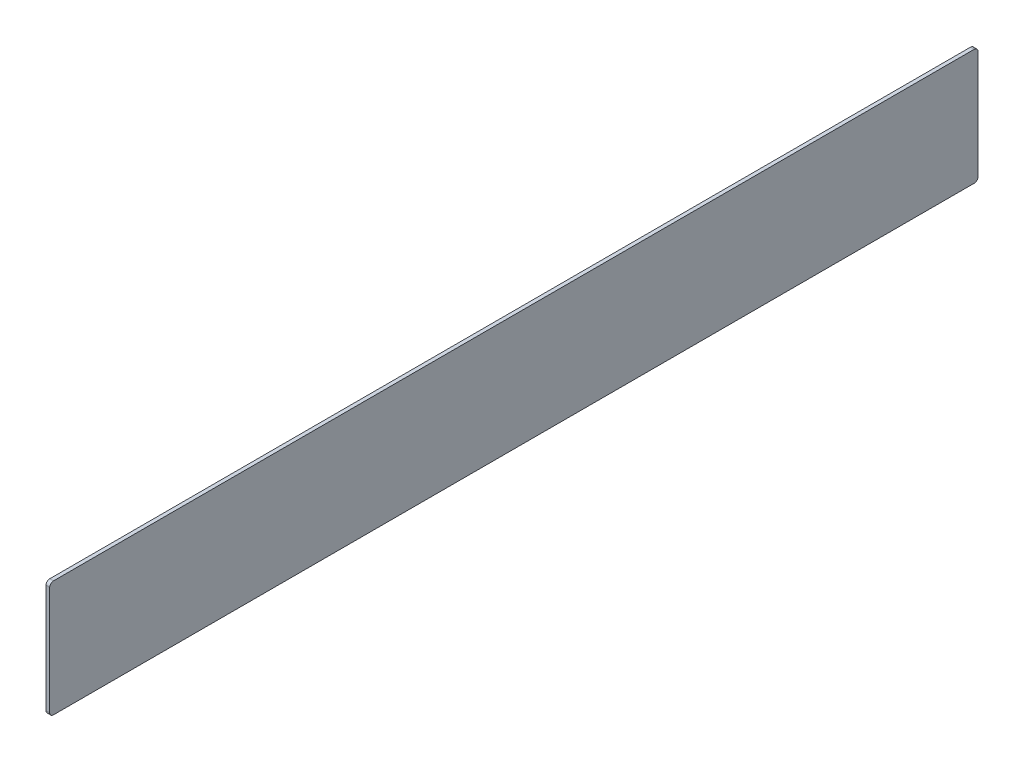
ISO-10303-21;
HEADER;
FILE_DESCRIPTION(('STEP AP214'),'2;1');
FILE_NAME('part.step','',(''),(''),'','','');
FILE_SCHEMA(('AUTOMOTIVE_DESIGN { 1 0 10303 214 1 1 1 1 }'));
ENDSEC;
DATA;
#1=APPLICATION_CONTEXT('core data for automotive mechanical design processes');
#2=APPLICATION_PROTOCOL_DEFINITION('international standard','automotive_design',2000,#1);
#3=PRODUCT_CONTEXT('',#1,'mechanical');
#4=PRODUCT('Part','Part','',(#3));
#5=PRODUCT_RELATED_PRODUCT_CATEGORY('part','',(#4));
#6=PRODUCT_DEFINITION_FORMATION('','',#4);
#7=PRODUCT_DEFINITION_CONTEXT('part definition',#1,'design');
#8=PRODUCT_DEFINITION('design','',#6,#7);
#9=PRODUCT_DEFINITION_SHAPE('','',#8);
#10=(LENGTH_UNIT() NAMED_UNIT(*) SI_UNIT(.MILLI.,.METRE.));
#11=(NAMED_UNIT(*) PLANE_ANGLE_UNIT() SI_UNIT($,.RADIAN.));
#12=(NAMED_UNIT(*) SI_UNIT($,.STERADIAN.) SOLID_ANGLE_UNIT());
#13=UNCERTAINTY_MEASURE_WITH_UNIT(LENGTH_MEASURE(1.E-05),#10,'distance_accuracy_value','');
#14=(GEOMETRIC_REPRESENTATION_CONTEXT(3) GLOBAL_UNCERTAINTY_ASSIGNED_CONTEXT((#13)) GLOBAL_UNIT_ASSIGNED_CONTEXT((#10,
#11,#12)) REPRESENTATION_CONTEXT('',''));
#15=CARTESIAN_POINT('',(0.,0.,0.));
#16=DIRECTION('',(0.,0.,1.));
#17=DIRECTION('',(1.,0.,0.));
#18=AXIS2_PLACEMENT_3D('',#15,#16,#17);
#19=CARTESIAN_POINT('',(2.,-77.7925531914894,269.946808510638));
#20=DIRECTION('',(0.,0.,-1.));
#21=DIRECTION('',(-1.,0.,0.));
#22=AXIS2_PLACEMENT_3D('',#19,#20,#21);
#23=PLANE('',#22);
#24=DIRECTION('',(0.,-1.,0.));
#25=VECTOR('',#24,1.);
#26=CARTESIAN_POINT('',(0.,-77.7925531914894,269.946808510638));
#27=LINE('',#26,#25);
#28=CARTESIAN_POINT('',(0.,-79.7925531914894,269.946808510638));
#29=VERTEX_POINT('',#28);
#30=CARTESIAN_POINT('',(0.,-138.292553191489,269.946808510638));
#31=VERTEX_POINT('',#30);
#32=EDGE_CURVE('E129',#29,#31,#27,.T.);
#33=ORIENTED_EDGE('',*,*,#32,.T.);
#34=DIRECTION('',(-1.,0.,0.));
#35=VECTOR('',#34,1.);
#36=CARTESIAN_POINT('',(2.,-138.292553191489,269.946808510638));
#37=LINE('',#36,#35);
#38=CARTESIAN_POINT('',(2.,-138.292553191489,269.946808510638));
#39=VERTEX_POINT('',#38);
#40=EDGE_CURVE('E11',#31,#39,#37,.F.);
#41=ORIENTED_EDGE('',*,*,#40,.T.);
#42=DIRECTION('',(0.,-1.,0.));
#43=VECTOR('',#42,1.);
#44=CARTESIAN_POINT('',(2.,-77.7925531914894,269.946808510638));
#45=LINE('',#44,#43);
#46=CARTESIAN_POINT('',(2.,-79.7925531914894,269.946808510638));
#47=VERTEX_POINT('',#46);
#48=EDGE_CURVE('E127',#47,#39,#45,.T.);
#49=ORIENTED_EDGE('',*,*,#48,.F.);
#50=DIRECTION('',(-1.,0.,0.));
#51=VECTOR('',#50,1.);
#52=CARTESIAN_POINT('',(2.,-79.7925531914894,269.946808510638));
#53=LINE('',#52,#51);
#54=EDGE_CURVE('E41',#47,#29,#53,.T.);
#55=ORIENTED_EDGE('',*,*,#54,.T.);
#56=EDGE_LOOP('',(#33,#41,#49,#55));
#57=FACE_BOUND('',#56,.T.);
#58=ADVANCED_FACE('F33',(#57),#23,.F.);
#59=CARTESIAN_POINT('',(2.,-140.292553191489,269.946808510638));
#60=DIRECTION('',(0.,1.,0.));
#61=DIRECTION('',(0.,0.,1.));
#62=AXIS2_PLACEMENT_3D('',#59,#60,#61);
#63=PLANE('',#62);
#64=DIRECTION('',(0.,0.,-1.));
#65=VECTOR('',#64,1.);
#66=CARTESIAN_POINT('',(0.,-140.292553191489,269.946808510638));
#67=LINE('',#66,#65);
#68=CARTESIAN_POINT('',(0.,-140.292553191489,267.946808510638));
#69=VERTEX_POINT('',#68);
#70=CARTESIAN_POINT('',(0.,-140.292553191489,-228.053191489362));
#71=VERTEX_POINT('',#70);
#72=EDGE_CURVE('E125',#69,#71,#67,.T.);
#73=ORIENTED_EDGE('',*,*,#72,.T.);
#74=DIRECTION('',(-1.,0.,0.));
#75=VECTOR('',#74,1.);
#76=CARTESIAN_POINT('',(2.,-140.292553191489,-228.053191489362));
#77=LINE('',#76,#75);
#78=CARTESIAN_POINT('',(2.,-140.292553191489,-228.053191489362));
#79=VERTEX_POINT('',#78);
#80=EDGE_CURVE('E104',#71,#79,#77,.F.);
#81=ORIENTED_EDGE('',*,*,#80,.T.);
#82=DIRECTION('',(0.,0.,-1.));
#83=VECTOR('',#82,1.);
#84=CARTESIAN_POINT('',(2.,-140.292553191489,269.946808510638));
#85=LINE('',#84,#83);
#86=CARTESIAN_POINT('',(2.,-140.292553191489,267.946808510638));
#87=VERTEX_POINT('',#86);
#88=EDGE_CURVE('E165',#87,#79,#85,.T.);
#89=ORIENTED_EDGE('',*,*,#88,.F.);
#90=DIRECTION('',(-1.,0.,0.));
#91=VECTOR('',#90,1.);
#92=CARTESIAN_POINT('',(2.,-140.292553191489,267.946808510638));
#93=LINE('',#92,#91);
#94=EDGE_CURVE('E109',#87,#69,#93,.T.);
#95=ORIENTED_EDGE('',*,*,#94,.T.);
#96=EDGE_LOOP('',(#73,#81,#89,#95));
#97=FACE_BOUND('',#96,.T.);
#98=ADVANCED_FACE('F175',(#97),#63,.F.);
#99=CARTESIAN_POINT('',(2.,-77.7925531914894,-230.053191489362));
#100=DIRECTION('',(0.,0.,1.));
#101=DIRECTION('',(0.,-1.,0.));
#102=AXIS2_PLACEMENT_3D('',#99,#100,#101);
#103=PLANE('',#102);
#104=DIRECTION('',(0.,1.,0.));
#105=VECTOR('',#104,1.);
#106=CARTESIAN_POINT('',(2.,-77.7925531914894,-230.053191489362));
#107=LINE('',#106,#105);
#108=CARTESIAN_POINT('',(2.,-138.292553191489,-230.053191489362));
#109=VERTEX_POINT('',#108);
#110=CARTESIAN_POINT('',(2.,-79.7925531914894,-230.053191489362));
#111=VERTEX_POINT('',#110);
#112=EDGE_CURVE('E118',#109,#111,#107,.T.);
#113=ORIENTED_EDGE('',*,*,#112,.F.);
#114=DIRECTION('',(-1.,0.,0.));
#115=VECTOR('',#114,1.);
#116=CARTESIAN_POINT('',(2.,-138.292553191489,-230.053191489362));
#117=LINE('',#116,#115);
#118=CARTESIAN_POINT('',(0.,-138.292553191489,-230.053191489362));
#119=VERTEX_POINT('',#118);
#120=EDGE_CURVE('E103',#109,#119,#117,.T.);
#121=ORIENTED_EDGE('',*,*,#120,.T.);
#122=DIRECTION('',(0.,1.,0.));
#123=VECTOR('',#122,1.);
#124=CARTESIAN_POINT('',(0.,-77.7925531914894,-230.053191489362));
#125=LINE('',#124,#123);
#126=CARTESIAN_POINT('',(0.,-79.7925531914894,-230.053191489362));
#127=VERTEX_POINT('',#126);
#128=EDGE_CURVE('E116',#119,#127,#125,.T.);
#129=ORIENTED_EDGE('',*,*,#128,.T.);
#130=DIRECTION('',(-1.,0.,0.));
#131=VECTOR('',#130,1.);
#132=CARTESIAN_POINT('',(2.,-79.7925531914894,-230.053191489362));
#133=LINE('',#132,#131);
#134=EDGE_CURVE('E120',#127,#111,#133,.F.);
#135=ORIENTED_EDGE('',*,*,#134,.T.);
#136=EDGE_LOOP('',(#113,#121,#129,#135));
#137=FACE_BOUND('',#136,.T.);
#138=ADVANCED_FACE('F115',(#137),#103,.F.);
#139=CARTESIAN_POINT('',(2.,-77.7925531914894,269.946808510638));
#140=DIRECTION('',(0.,-1.,0.));
#141=DIRECTION('',(0.,0.,-1.));
#142=AXIS2_PLACEMENT_3D('',#139,#140,#141);
#143=PLANE('',#142);
#144=DIRECTION('',(0.,0.,1.));
#145=VECTOR('',#144,1.);
#146=CARTESIAN_POINT('',(2.,-77.7925531914894,269.946808510638));
#147=LINE('',#146,#145);
#148=CARTESIAN_POINT('',(2.,-77.7925531914894,-228.053191489362));
#149=VERTEX_POINT('',#148);
#150=CARTESIAN_POINT('',(2.,-77.7925531914894,267.946808510638));
#151=VERTEX_POINT('',#150);
#152=EDGE_CURVE('E133',#149,#151,#147,.T.);
#153=ORIENTED_EDGE('',*,*,#152,.F.);
#154=DIRECTION('',(-1.,0.,0.));
#155=VECTOR('',#154,1.);
#156=CARTESIAN_POINT('',(2.,-77.7925531914894,-228.053191489362));
#157=LINE('',#156,#155);
#158=CARTESIAN_POINT('',(0.,-77.7925531914894,-228.053191489362));
#159=VERTEX_POINT('',#158);
#160=EDGE_CURVE('E150',#149,#159,#157,.T.);
#161=ORIENTED_EDGE('',*,*,#160,.T.);
#162=DIRECTION('',(0.,0.,1.));
#163=VECTOR('',#162,1.);
#164=CARTESIAN_POINT('',(0.,-77.7925531914894,269.946808510638));
#165=LINE('',#164,#163);
#166=CARTESIAN_POINT('',(0.,-77.7925531914894,267.946808510638));
#167=VERTEX_POINT('',#166);
#168=EDGE_CURVE('E124',#159,#167,#165,.T.);
#169=ORIENTED_EDGE('',*,*,#168,.T.);
#170=DIRECTION('',(-1.,0.,0.));
#171=VECTOR('',#170,1.);
#172=CARTESIAN_POINT('',(2.,-77.7925531914894,267.946808510638));
#173=LINE('',#172,#171);
#174=EDGE_CURVE('E48',#167,#151,#173,.F.);
#175=ORIENTED_EDGE('',*,*,#174,.T.);
#176=EDGE_LOOP('',(#153,#161,#169,#175));
#177=FACE_BOUND('',#176,.T.);
#178=ADVANCED_FACE('F179',(#177),#143,.F.);
#179=CARTESIAN_POINT('',(2.,0.,0.));
#180=DIRECTION('',(1.,0.,0.));
#181=DIRECTION('',(0.,0.,-1.));
#182=AXIS2_PLACEMENT_3D('',#179,#180,#181);
#183=PLANE('',#182);
#184=ORIENTED_EDGE('',*,*,#88,.T.);
#185=CARTESIAN_POINT('',(2.,-138.292553191489,-228.053191489362));
#186=DIRECTION('',(1.,0.,0.));
#187=DIRECTION('',(0.,0.,-1.));
#188=AXIS2_PLACEMENT_3D('',#185,#186,#187);
#189=CIRCLE('',#188,2.);
#190=EDGE_CURVE('E147',#79,#109,#189,.T.);
#191=ORIENTED_EDGE('',*,*,#190,.T.);
#192=ORIENTED_EDGE('',*,*,#112,.T.);
#193=CARTESIAN_POINT('',(2.,-79.7925531914894,-228.053191489362));
#194=DIRECTION('',(1.,0.,0.));
#195=DIRECTION('',(0.,0.,-1.));
#196=AXIS2_PLACEMENT_3D('',#193,#194,#195);
#197=CIRCLE('',#196,2.);
#198=EDGE_CURVE('E55',#111,#149,#197,.T.);
#199=ORIENTED_EDGE('',*,*,#198,.T.);
#200=ORIENTED_EDGE('',*,*,#152,.T.);
#201=CARTESIAN_POINT('',(2.,-79.7925531914894,267.946808510638));
#202=DIRECTION('',(1.,0.,0.));
#203=DIRECTION('',(0.,0.,-1.));
#204=AXIS2_PLACEMENT_3D('',#201,#202,#203);
#205=CIRCLE('',#204,2.);
#206=EDGE_CURVE('E142',#151,#47,#205,.T.);
#207=ORIENTED_EDGE('',*,*,#206,.T.);
#208=ORIENTED_EDGE('',*,*,#48,.T.);
#209=CARTESIAN_POINT('',(2.,-138.292553191489,267.946808510638));
#210=DIRECTION('',(1.,0.,0.));
#211=DIRECTION('',(0.,0.,-1.));
#212=AXIS2_PLACEMENT_3D('',#209,#210,#211);
#213=CIRCLE('',#212,2.);
#214=EDGE_CURVE('E144',#39,#87,#213,.T.);
#215=ORIENTED_EDGE('',*,*,#214,.T.);
#216=EDGE_LOOP('',(#184,#191,#192,#199,#200,#207,#208,#215));
#217=FACE_BOUND('',#216,.T.);
#218=ADVANCED_FACE('F169',(#217),#183,.T.);
#219=CARTESIAN_POINT('',(0.,0.,0.));
#220=DIRECTION('',(1.,0.,0.));
#221=DIRECTION('',(0.,0.,-1.));
#222=AXIS2_PLACEMENT_3D('',#219,#220,#221);
#223=PLANE('',#222);
#224=ORIENTED_EDGE('',*,*,#128,.F.);
#225=CARTESIAN_POINT('',(0.,-138.292553191489,-228.053191489362));
#226=DIRECTION('',(1.,0.,0.));
#227=DIRECTION('',(0.,0.,-1.));
#228=AXIS2_PLACEMENT_3D('',#225,#226,#227);
#229=CIRCLE('',#228,2.);
#230=EDGE_CURVE('E99',#119,#71,#229,.F.);
#231=ORIENTED_EDGE('',*,*,#230,.T.);
#232=ORIENTED_EDGE('',*,*,#72,.F.);
#233=CARTESIAN_POINT('',(0.,-138.292553191489,267.946808510638));
#234=DIRECTION('',(1.,0.,0.));
#235=DIRECTION('',(0.,0.,-1.));
#236=AXIS2_PLACEMENT_3D('',#233,#234,#235);
#237=CIRCLE('',#236,2.);
#238=EDGE_CURVE('E136',#69,#31,#237,.F.);
#239=ORIENTED_EDGE('',*,*,#238,.T.);
#240=ORIENTED_EDGE('',*,*,#32,.F.);
#241=CARTESIAN_POINT('',(0.,-79.7925531914894,267.946808510638));
#242=DIRECTION('',(1.,0.,0.));
#243=DIRECTION('',(0.,0.,-1.));
#244=AXIS2_PLACEMENT_3D('',#241,#242,#243);
#245=CIRCLE('',#244,2.);
#246=EDGE_CURVE('E119',#29,#167,#245,.F.);
#247=ORIENTED_EDGE('',*,*,#246,.T.);
#248=ORIENTED_EDGE('',*,*,#168,.F.);
#249=CARTESIAN_POINT('',(0.,-79.7925531914894,-228.053191489362));
#250=DIRECTION('',(1.,0.,0.));
#251=DIRECTION('',(0.,0.,-1.));
#252=AXIS2_PLACEMENT_3D('',#249,#250,#251);
#253=CIRCLE('',#252,2.);
#254=EDGE_CURVE('E110',#159,#127,#253,.F.);
#255=ORIENTED_EDGE('',*,*,#254,.T.);
#256=EDGE_LOOP('',(#224,#231,#232,#239,#240,#247,#248,#255));
#257=FACE_BOUND('',#256,.T.);
#258=ADVANCED_FACE('F122',(#257),#223,.F.);
#259=CARTESIAN_POINT('',(2.,-138.292553191489,-228.053191489362));
#260=DIRECTION('',(-1.,0.,0.));
#261=DIRECTION('',(0.,0.,1.));
#262=AXIS2_PLACEMENT_3D('',#259,#260,#261);
#263=CYLINDRICAL_SURFACE('',#262,2.);
#264=ORIENTED_EDGE('',*,*,#190,.F.);
#265=ORIENTED_EDGE('',*,*,#80,.F.);
#266=ORIENTED_EDGE('',*,*,#230,.F.);
#267=ORIENTED_EDGE('',*,*,#120,.F.);
#268=EDGE_LOOP('',(#264,#265,#266,#267));
#269=FACE_BOUND('',#268,.T.);
#270=ADVANCED_FACE('F102',(#269),#263,.T.);
#271=CARTESIAN_POINT('',(2.,-79.7925531914894,-228.053191489362));
#272=DIRECTION('',(-1.,0.,0.));
#273=DIRECTION('',(0.,0.,1.));
#274=AXIS2_PLACEMENT_3D('',#271,#272,#273);
#275=CYLINDRICAL_SURFACE('',#274,2.);
#276=ORIENTED_EDGE('',*,*,#198,.F.);
#277=ORIENTED_EDGE('',*,*,#134,.F.);
#278=ORIENTED_EDGE('',*,*,#254,.F.);
#279=ORIENTED_EDGE('',*,*,#160,.F.);
#280=EDGE_LOOP('',(#276,#277,#278,#279));
#281=FACE_BOUND('',#280,.T.);
#282=ADVANCED_FACE('F178',(#281),#275,.T.);
#283=CARTESIAN_POINT('',(2.,-138.292553191489,267.946808510638));
#284=DIRECTION('',(-1.,0.,0.));
#285=DIRECTION('',(0.,0.,1.));
#286=AXIS2_PLACEMENT_3D('',#283,#284,#285);
#287=CYLINDRICAL_SURFACE('',#286,2.);
#288=ORIENTED_EDGE('',*,*,#214,.F.);
#289=ORIENTED_EDGE('',*,*,#40,.F.);
#290=ORIENTED_EDGE('',*,*,#238,.F.);
#291=ORIENTED_EDGE('',*,*,#94,.F.);
#292=EDGE_LOOP('',(#288,#289,#290,#291));
#293=FACE_BOUND('',#292,.T.);
#294=ADVANCED_FACE('F173',(#293),#287,.T.);
#295=CARTESIAN_POINT('',(2.,-79.7925531914894,267.946808510638));
#296=DIRECTION('',(-1.,0.,0.));
#297=DIRECTION('',(0.,0.,1.));
#298=AXIS2_PLACEMENT_3D('',#295,#296,#297);
#299=CYLINDRICAL_SURFACE('',#298,2.);
#300=ORIENTED_EDGE('',*,*,#206,.F.);
#301=ORIENTED_EDGE('',*,*,#174,.F.);
#302=ORIENTED_EDGE('',*,*,#246,.F.);
#303=ORIENTED_EDGE('',*,*,#54,.F.);
#304=EDGE_LOOP('',(#300,#301,#302,#303));
#305=FACE_BOUND('',#304,.T.);
#306=ADVANCED_FACE('F35',(#305),#299,.T.);
#307=CLOSED_SHELL('',(#58,#98,#138,#178,#218,#258,#270,#282,#294,#306));
#308=MANIFOLD_SOLID_BREP('B2',#307);
#309=ADVANCED_BREP_SHAPE_REPRESENTATION('',(#18,#308),#14);
#310=SHAPE_DEFINITION_REPRESENTATION(#9,#309);
ENDSEC;
END-ISO-10303-21;
